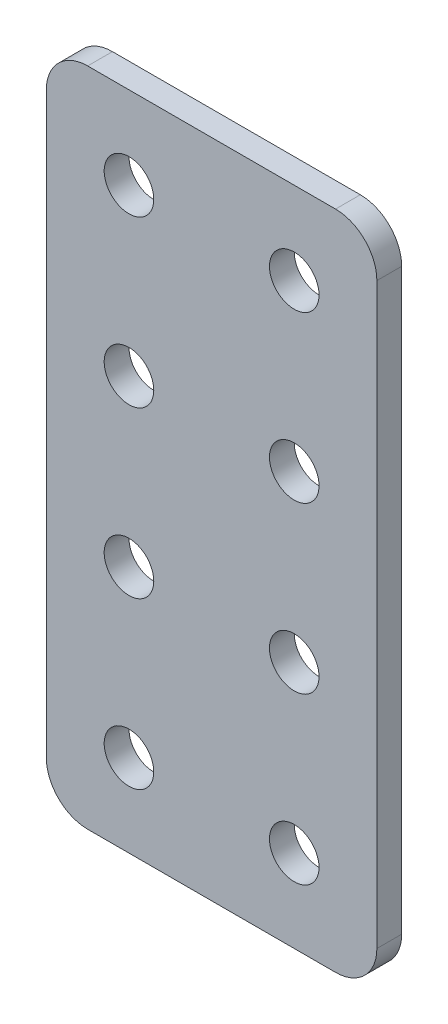
ISO-10303-21;
HEADER;
FILE_DESCRIPTION(('STEP AP214'),'2;1');
FILE_NAME('part.step','',(''),(''),'','','');
FILE_SCHEMA(('AUTOMOTIVE_DESIGN { 1 0 10303 214 1 1 1 1 }'));
ENDSEC;
DATA;
#1=APPLICATION_CONTEXT('core data for automotive mechanical design processes');
#2=APPLICATION_PROTOCOL_DEFINITION('international standard','automotive_design',2000,#1);
#3=PRODUCT_CONTEXT('',#1,'mechanical');
#4=PRODUCT('Part','Part','',(#3));
#5=PRODUCT_RELATED_PRODUCT_CATEGORY('part','',(#4));
#6=PRODUCT_DEFINITION_FORMATION('','',#4);
#7=PRODUCT_DEFINITION_CONTEXT('part definition',#1,'design');
#8=PRODUCT_DEFINITION('design','',#6,#7);
#9=PRODUCT_DEFINITION_SHAPE('','',#8);
#10=(LENGTH_UNIT() NAMED_UNIT(*) SI_UNIT(.MILLI.,.METRE.));
#11=(NAMED_UNIT(*) PLANE_ANGLE_UNIT() SI_UNIT($,.RADIAN.));
#12=(NAMED_UNIT(*) SI_UNIT($,.STERADIAN.) SOLID_ANGLE_UNIT());
#13=UNCERTAINTY_MEASURE_WITH_UNIT(LENGTH_MEASURE(1.E-05),#10,'distance_accuracy_value','');
#14=(GEOMETRIC_REPRESENTATION_CONTEXT(3) GLOBAL_UNCERTAINTY_ASSIGNED_CONTEXT((#13)) GLOBAL_UNIT_ASSIGNED_CONTEXT((#10,
#11,#12)) REPRESENTATION_CONTEXT('',''));
#15=CARTESIAN_POINT('',(0.,0.,0.));
#16=DIRECTION('',(0.,0.,1.));
#17=DIRECTION('',(1.,0.,0.));
#18=AXIS2_PLACEMENT_3D('',#15,#16,#17);
#19=CARTESIAN_POINT('',(0.,0.,3.));
#20=DIRECTION('',(0.,0.,1.));
#21=DIRECTION('',(1.,0.,0.));
#22=AXIS2_PLACEMENT_3D('',#19,#20,#21);
#23=PLANE('',#22);
#24=CARTESIAN_POINT('',(-16.4907902554961,7.41176470588237,3.));
#25=DIRECTION('',(0.,0.,1.));
#26=DIRECTION('',(1.,0.,0.));
#27=AXIS2_PLACEMENT_3D('',#24,#25,#26);
#28=CIRCLE('',#27,3.);
#29=CARTESIAN_POINT('',(-13.4907902554961,7.41176470588237,3.));
#30=VERTEX_POINT('',#29);
#31=EDGE_CURVE('E190',#30,#30,#28,.T.);
#32=ORIENTED_EDGE('',*,*,#31,.F.);
#33=EDGE_LOOP('',(#32));
#34=FACE_BOUND('',#33,.T.);
#35=CARTESIAN_POINT('',(-16.4907902554962,27.4117647058824,3.));
#36=DIRECTION('',(0.,0.,1.));
#37=DIRECTION('',(1.,0.,0.));
#38=AXIS2_PLACEMENT_3D('',#35,#36,#37);
#39=CIRCLE('',#38,3.);
#40=CARTESIAN_POINT('',(-13.4907902554962,27.4117647058824,3.));
#41=VERTEX_POINT('',#40);
#42=EDGE_CURVE('E132',#41,#41,#39,.T.);
#43=ORIENTED_EDGE('',*,*,#42,.F.);
#44=EDGE_LOOP('',(#43));
#45=FACE_BOUND('',#44,.T.);
#46=DIRECTION('',(-1.,0.,0.));
#47=VECTOR('',#46,1.);
#48=CARTESIAN_POINT('',(-26.4907902554961,-42.5882352941176,3.));
#49=LINE('',#48,#47);
#50=CARTESIAN_POINT('',(8.50920974450387,-42.5882352941176,3.));
#51=VERTEX_POINT('',#50);
#52=CARTESIAN_POINT('',(-21.4907902554961,-42.5882352941176,3.));
#53=VERTEX_POINT('',#52);
#54=EDGE_CURVE('E174',#51,#53,#49,.T.);
#55=ORIENTED_EDGE('',*,*,#54,.F.);
#56=CARTESIAN_POINT('',(8.50920974450387,-37.5882352941176,3.));
#57=DIRECTION('',(0.,0.,1.));
#58=DIRECTION('',(1.,0.,0.));
#59=AXIS2_PLACEMENT_3D('',#56,#57,#58);
#60=CIRCLE('',#59,5.);
#61=CARTESIAN_POINT('',(13.5092097445039,-37.5882352941176,3.));
#62=VERTEX_POINT('',#61);
#63=EDGE_CURVE('E149',#51,#62,#60,.T.);
#64=ORIENTED_EDGE('',*,*,#63,.T.);
#65=DIRECTION('',(0.,1.,0.));
#66=VECTOR('',#65,1.);
#67=CARTESIAN_POINT('',(13.5092097445039,37.4117647058824,3.));
#68=LINE('',#67,#66);
#69=CARTESIAN_POINT('',(13.5092097445039,32.4117647058824,3.));
#70=VERTEX_POINT('',#69);
#71=EDGE_CURVE('E118',#62,#70,#68,.T.);
#72=ORIENTED_EDGE('',*,*,#71,.T.);
#73=CARTESIAN_POINT('',(8.50920974450385,32.4117647058824,3.));
#74=DIRECTION('',(0.,0.,1.));
#75=DIRECTION('',(1.,0.,0.));
#76=AXIS2_PLACEMENT_3D('',#73,#74,#75);
#77=CIRCLE('',#76,5.);
#78=CARTESIAN_POINT('',(8.50920974450385,37.4117647058824,3.));
#79=VERTEX_POINT('',#78);
#80=EDGE_CURVE('E54',#70,#79,#77,.T.);
#81=ORIENTED_EDGE('',*,*,#80,.T.);
#82=DIRECTION('',(-1.,0.,0.));
#83=VECTOR('',#82,1.);
#84=CARTESIAN_POINT('',(-26.4907902554961,37.4117647058824,3.));
#85=LINE('',#84,#83);
#86=CARTESIAN_POINT('',(-21.4907902554961,37.4117647058824,3.));
#87=VERTEX_POINT('',#86);
#88=EDGE_CURVE('E136',#79,#87,#85,.T.);
#89=ORIENTED_EDGE('',*,*,#88,.T.);
#90=CARTESIAN_POINT('',(-21.4907902554961,32.4117647058824,3.));
#91=DIRECTION('',(0.,0.,1.));
#92=DIRECTION('',(1.,0.,0.));
#93=AXIS2_PLACEMENT_3D('',#90,#91,#92);
#94=CIRCLE('',#93,5.);
#95=CARTESIAN_POINT('',(-26.4907902554961,32.4117647058824,3.));
#96=VERTEX_POINT('',#95);
#97=EDGE_CURVE('E144',#87,#96,#94,.T.);
#98=ORIENTED_EDGE('',*,*,#97,.T.);
#99=DIRECTION('',(0.,-1.,0.));
#100=VECTOR('',#99,1.);
#101=CARTESIAN_POINT('',(-26.4907902554961,37.4117647058824,3.));
#102=LINE('',#101,#100);
#103=CARTESIAN_POINT('',(-26.4907902554961,-37.5882352941176,3.));
#104=VERTEX_POINT('',#103);
#105=EDGE_CURVE('E129',#96,#104,#102,.T.);
#106=ORIENTED_EDGE('',*,*,#105,.T.);
#107=CARTESIAN_POINT('',(-21.4907902554961,-37.5882352941176,3.));
#108=DIRECTION('',(0.,0.,1.));
#109=DIRECTION('',(1.,0.,0.));
#110=AXIS2_PLACEMENT_3D('',#107,#108,#109);
#111=CIRCLE('',#110,5.);
#112=EDGE_CURVE('E147',#104,#53,#111,.T.);
#113=ORIENTED_EDGE('',*,*,#112,.T.);
#114=EDGE_LOOP('',(#55,#64,#72,#81,#89,#98,#106,#113));
#115=FACE_BOUND('',#114,.T.);
#116=CARTESIAN_POINT('',(3.50920974450385,27.4117647058824,3.));
#117=DIRECTION('',(0.,0.,1.));
#118=DIRECTION('',(1.,0.,0.));
#119=AXIS2_PLACEMENT_3D('',#116,#117,#118);
#120=CIRCLE('',#119,3.);
#121=CARTESIAN_POINT('',(6.50920974450385,27.4117647058824,3.));
#122=VERTEX_POINT('',#121);
#123=EDGE_CURVE('E196',#122,#122,#120,.T.);
#124=ORIENTED_EDGE('',*,*,#123,.F.);
#125=EDGE_LOOP('',(#124));
#126=FACE_BOUND('',#125,.T.);
#127=CARTESIAN_POINT('',(3.50920974450386,7.41176470588237,3.));
#128=DIRECTION('',(0.,0.,1.));
#129=DIRECTION('',(1.,0.,0.));
#130=AXIS2_PLACEMENT_3D('',#127,#128,#129);
#131=CIRCLE('',#130,3.);
#132=CARTESIAN_POINT('',(6.50920974450386,7.41176470588237,3.));
#133=VERTEX_POINT('',#132);
#134=EDGE_CURVE('E184',#133,#133,#131,.T.);
#135=ORIENTED_EDGE('',*,*,#134,.F.);
#136=EDGE_LOOP('',(#135));
#137=FACE_BOUND('',#136,.T.);
#138=CARTESIAN_POINT('',(3.50920974450386,-12.5882352941176,3.));
#139=DIRECTION('',(0.,0.,-1.));
#140=DIRECTION('',(1.,0.,0.));
#141=AXIS2_PLACEMENT_3D('',#138,#139,#140);
#142=CIRCLE('',#141,3.);
#143=CARTESIAN_POINT('',(6.50920974450386,-12.5882352941176,3.));
#144=VERTEX_POINT('',#143);
#145=EDGE_CURVE('E307',#144,#144,#142,.T.);
#146=ORIENTED_EDGE('',*,*,#145,.T.);
#147=EDGE_LOOP('',(#146));
#148=FACE_BOUND('',#147,.T.);
#149=CARTESIAN_POINT('',(-16.4907902554961,-12.5882352941176,3.));
#150=DIRECTION('',(0.,0.,-1.));
#151=DIRECTION('',(1.,0.,0.));
#152=AXIS2_PLACEMENT_3D('',#149,#150,#151);
#153=CIRCLE('',#152,3.);
#154=CARTESIAN_POINT('',(-13.4907902554961,-12.5882352941176,3.));
#155=VERTEX_POINT('',#154);
#156=EDGE_CURVE('E304',#155,#155,#153,.T.);
#157=ORIENTED_EDGE('',*,*,#156,.T.);
#158=EDGE_LOOP('',(#157));
#159=FACE_BOUND('',#158,.T.);
#160=CARTESIAN_POINT('',(3.50920974450385,-32.5882352941176,3.));
#161=DIRECTION('',(0.,0.,-1.));
#162=DIRECTION('',(1.,0.,0.));
#163=AXIS2_PLACEMENT_3D('',#160,#161,#162);
#164=CIRCLE('',#163,3.);
#165=CARTESIAN_POINT('',(6.50920974450385,-32.5882352941176,3.));
#166=VERTEX_POINT('',#165);
#167=EDGE_CURVE('E300',#166,#166,#164,.T.);
#168=ORIENTED_EDGE('',*,*,#167,.T.);
#169=EDGE_LOOP('',(#168));
#170=FACE_BOUND('',#169,.T.);
#171=CARTESIAN_POINT('',(-16.4907902554962,-32.5882352941176,3.));
#172=DIRECTION('',(0.,0.,-1.));
#173=DIRECTION('',(1.,0.,0.));
#174=AXIS2_PLACEMENT_3D('',#171,#172,#173);
#175=CIRCLE('',#174,3.);
#176=CARTESIAN_POINT('',(-13.4907902554962,-32.5882352941176,3.));
#177=VERTEX_POINT('',#176);
#178=EDGE_CURVE('E175',#177,#177,#175,.T.);
#179=ORIENTED_EDGE('',*,*,#178,.T.);
#180=EDGE_LOOP('',(#179));
#181=FACE_BOUND('',#180,.T.);
#182=ADVANCED_FACE('F33',(#34,#45,#115,#126,#137,#148,#159,#170,#181),#23,.T.);
#183=CARTESIAN_POINT('',(0.,0.,0.));
#184=DIRECTION('',(0.,0.,1.));
#185=DIRECTION('',(1.,0.,0.));
#186=AXIS2_PLACEMENT_3D('',#183,#184,#185);
#187=PLANE('',#186);
#188=DIRECTION('',(0.,1.,0.));
#189=VECTOR('',#188,1.);
#190=CARTESIAN_POINT('',(13.5092097445039,37.4117647058824,0.));
#191=LINE('',#190,#189);
#192=CARTESIAN_POINT('',(13.5092097445039,-37.5882352941176,0.));
#193=VERTEX_POINT('',#192);
#194=CARTESIAN_POINT('',(13.5092097445039,32.4117647058824,0.));
#195=VERTEX_POINT('',#194);
#196=EDGE_CURVE('E116',#193,#195,#191,.T.);
#197=ORIENTED_EDGE('',*,*,#196,.F.);
#198=CARTESIAN_POINT('',(8.50920974450387,-37.5882352941176,0.));
#199=DIRECTION('',(0.,0.,1.));
#200=DIRECTION('',(1.,0.,0.));
#201=AXIS2_PLACEMENT_3D('',#198,#199,#200);
#202=CIRCLE('',#201,5.);
#203=CARTESIAN_POINT('',(8.50920974450387,-42.5882352941176,0.));
#204=VERTEX_POINT('',#203);
#205=EDGE_CURVE('E99',#193,#204,#202,.F.);
#206=ORIENTED_EDGE('',*,*,#205,.T.);
#207=DIRECTION('',(-1.,0.,0.));
#208=VECTOR('',#207,1.);
#209=CARTESIAN_POINT('',(-26.4907902554961,-42.5882352941176,0.));
#210=LINE('',#209,#208);
#211=CARTESIAN_POINT('',(-21.4907902554961,-42.5882352941176,0.));
#212=VERTEX_POINT('',#211);
#213=EDGE_CURVE('E173',#204,#212,#210,.T.);
#214=ORIENTED_EDGE('',*,*,#213,.T.);
#215=CARTESIAN_POINT('',(-21.4907902554961,-37.5882352941176,0.));
#216=DIRECTION('',(0.,0.,1.));
#217=DIRECTION('',(1.,0.,0.));
#218=AXIS2_PLACEMENT_3D('',#215,#216,#217);
#219=CIRCLE('',#218,5.);
#220=CARTESIAN_POINT('',(-26.4907902554961,-37.5882352941176,0.));
#221=VERTEX_POINT('',#220);
#222=EDGE_CURVE('E110',#212,#221,#219,.F.);
#223=ORIENTED_EDGE('',*,*,#222,.T.);
#224=DIRECTION('',(0.,-1.,0.));
#225=VECTOR('',#224,1.);
#226=CARTESIAN_POINT('',(-26.4907902554961,37.4117647058824,0.));
#227=LINE('',#226,#225);
#228=CARTESIAN_POINT('',(-26.4907902554961,32.4117647058824,0.));
#229=VERTEX_POINT('',#228);
#230=EDGE_CURVE('E127',#229,#221,#227,.T.);
#231=ORIENTED_EDGE('',*,*,#230,.F.);
#232=CARTESIAN_POINT('',(-21.4907902554961,32.4117647058824,0.));
#233=DIRECTION('',(0.,0.,1.));
#234=DIRECTION('',(1.,0.,0.));
#235=AXIS2_PLACEMENT_3D('',#232,#233,#234);
#236=CIRCLE('',#235,5.);
#237=CARTESIAN_POINT('',(-21.4907902554961,37.4117647058824,0.));
#238=VERTEX_POINT('',#237);
#239=EDGE_CURVE('E119',#229,#238,#236,.F.);
#240=ORIENTED_EDGE('',*,*,#239,.T.);
#241=DIRECTION('',(-1.,0.,0.));
#242=VECTOR('',#241,1.);
#243=CARTESIAN_POINT('',(-26.4907902554961,37.4117647058824,0.));
#244=LINE('',#243,#242);
#245=CARTESIAN_POINT('',(8.50920974450385,37.4117647058824,0.));
#246=VERTEX_POINT('',#245);
#247=EDGE_CURVE('E126',#246,#238,#244,.T.);
#248=ORIENTED_EDGE('',*,*,#247,.F.);
#249=CARTESIAN_POINT('',(8.50920974450385,32.4117647058824,0.));
#250=DIRECTION('',(0.,0.,1.));
#251=DIRECTION('',(1.,0.,0.));
#252=AXIS2_PLACEMENT_3D('',#249,#250,#251);
#253=CIRCLE('',#252,5.);
#254=EDGE_CURVE('E125',#246,#195,#253,.F.);
#255=ORIENTED_EDGE('',*,*,#254,.T.);
#256=EDGE_LOOP('',(#197,#206,#214,#223,#231,#240,#248,#255));
#257=FACE_BOUND('',#256,.T.);
#258=CARTESIAN_POINT('',(-16.4907902554962,27.4117647058824,0.));
#259=DIRECTION('',(0.,0.,1.));
#260=DIRECTION('',(1.,0.,0.));
#261=AXIS2_PLACEMENT_3D('',#258,#259,#260);
#262=CIRCLE('',#261,3.);
#263=CARTESIAN_POINT('',(-13.4907902554962,27.4117647058824,0.));
#264=VERTEX_POINT('',#263);
#265=EDGE_CURVE('E199',#264,#264,#262,.T.);
#266=ORIENTED_EDGE('',*,*,#265,.T.);
#267=EDGE_LOOP('',(#266));
#268=FACE_BOUND('',#267,.T.);
#269=CARTESIAN_POINT('',(3.50920974450385,27.4117647058824,0.));
#270=DIRECTION('',(0.,0.,1.));
#271=DIRECTION('',(1.,0.,0.));
#272=AXIS2_PLACEMENT_3D('',#269,#270,#271);
#273=CIRCLE('',#272,3.);
#274=CARTESIAN_POINT('',(6.50920974450385,27.4117647058824,0.));
#275=VERTEX_POINT('',#274);
#276=EDGE_CURVE('E193',#275,#275,#273,.T.);
#277=ORIENTED_EDGE('',*,*,#276,.T.);
#278=EDGE_LOOP('',(#277));
#279=FACE_BOUND('',#278,.T.);
#280=CARTESIAN_POINT('',(-16.4907902554961,7.41176470588237,0.));
#281=DIRECTION('',(0.,0.,1.));
#282=DIRECTION('',(1.,0.,0.));
#283=AXIS2_PLACEMENT_3D('',#280,#281,#282);
#284=CIRCLE('',#283,3.);
#285=CARTESIAN_POINT('',(-13.4907902554961,7.41176470588237,0.));
#286=VERTEX_POINT('',#285);
#287=EDGE_CURVE('E187',#286,#286,#284,.T.);
#288=ORIENTED_EDGE('',*,*,#287,.T.);
#289=EDGE_LOOP('',(#288));
#290=FACE_BOUND('',#289,.T.);
#291=CARTESIAN_POINT('',(3.50920974450386,7.41176470588237,0.));
#292=DIRECTION('',(0.,0.,1.));
#293=DIRECTION('',(1.,0.,0.));
#294=AXIS2_PLACEMENT_3D('',#291,#292,#293);
#295=CIRCLE('',#294,3.);
#296=CARTESIAN_POINT('',(6.50920974450386,7.41176470588237,0.));
#297=VERTEX_POINT('',#296);
#298=EDGE_CURVE('E177',#297,#297,#295,.T.);
#299=ORIENTED_EDGE('',*,*,#298,.T.);
#300=EDGE_LOOP('',(#299));
#301=FACE_BOUND('',#300,.T.);
#302=CARTESIAN_POINT('',(3.50920974450386,-12.5882352941176,0.));
#303=DIRECTION('',(0.,0.,-1.));
#304=DIRECTION('',(1.,0.,0.));
#305=AXIS2_PLACEMENT_3D('',#302,#303,#304);
#306=CIRCLE('',#305,3.);
#307=CARTESIAN_POINT('',(6.50920974450386,-12.5882352941176,0.));
#308=VERTEX_POINT('',#307);
#309=EDGE_CURVE('E288',#308,#308,#306,.T.);
#310=ORIENTED_EDGE('',*,*,#309,.F.);
#311=EDGE_LOOP('',(#310));
#312=FACE_BOUND('',#311,.T.);
#313=CARTESIAN_POINT('',(-16.4907902554961,-12.5882352941176,0.));
#314=DIRECTION('',(0.,0.,-1.));
#315=DIRECTION('',(1.,0.,0.));
#316=AXIS2_PLACEMENT_3D('',#313,#314,#315);
#317=CIRCLE('',#316,3.);
#318=CARTESIAN_POINT('',(-13.4907902554961,-12.5882352941176,0.));
#319=VERTEX_POINT('',#318);
#320=EDGE_CURVE('E292',#319,#319,#317,.T.);
#321=ORIENTED_EDGE('',*,*,#320,.F.);
#322=EDGE_LOOP('',(#321));
#323=FACE_BOUND('',#322,.T.);
#324=CARTESIAN_POINT('',(3.50920974450385,-32.5882352941176,0.));
#325=DIRECTION('',(0.,0.,-1.));
#326=DIRECTION('',(1.,0.,0.));
#327=AXIS2_PLACEMENT_3D('',#324,#325,#326);
#328=CIRCLE('',#327,3.);
#329=CARTESIAN_POINT('',(6.50920974450385,-32.5882352941176,0.));
#330=VERTEX_POINT('',#329);
#331=EDGE_CURVE('E296',#330,#330,#328,.T.);
#332=ORIENTED_EDGE('',*,*,#331,.F.);
#333=EDGE_LOOP('',(#332));
#334=FACE_BOUND('',#333,.T.);
#335=CARTESIAN_POINT('',(-16.4907902554962,-32.5882352941176,0.));
#336=DIRECTION('',(0.,0.,-1.));
#337=DIRECTION('',(1.,0.,0.));
#338=AXIS2_PLACEMENT_3D('',#335,#336,#337);
#339=CIRCLE('',#338,3.);
#340=CARTESIAN_POINT('',(-13.4907902554962,-32.5882352941176,0.));
#341=VERTEX_POINT('',#340);
#342=EDGE_CURVE('E180',#341,#341,#339,.T.);
#343=ORIENTED_EDGE('',*,*,#342,.F.);
#344=EDGE_LOOP('',(#343));
#345=FACE_BOUND('',#344,.T.);
#346=ADVANCED_FACE('F122',(#257,#268,#279,#290,#301,#312,#323,#334,#345),#187,.F.);
#347=CARTESIAN_POINT('',(-26.4907902554961,37.4117647058824,3.));
#348=DIRECTION('',(1.,0.,0.));
#349=DIRECTION('',(0.,1.,0.));
#350=AXIS2_PLACEMENT_3D('',#347,#348,#349);
#351=PLANE('',#350);
#352=ORIENTED_EDGE('',*,*,#230,.T.);
#353=DIRECTION('',(0.,0.,-1.));
#354=VECTOR('',#353,1.);
#355=CARTESIAN_POINT('',(-26.4907902554961,-37.5882352941176,3.));
#356=LINE('',#355,#354);
#357=EDGE_CURVE('E154',#221,#104,#356,.F.);
#358=ORIENTED_EDGE('',*,*,#357,.T.);
#359=ORIENTED_EDGE('',*,*,#105,.F.);
#360=DIRECTION('',(0.,0.,-1.));
#361=VECTOR('',#360,1.);
#362=CARTESIAN_POINT('',(-26.4907902554961,32.4117647058824,3.));
#363=LINE('',#362,#361);
#364=EDGE_CURVE('E151',#96,#229,#363,.T.);
#365=ORIENTED_EDGE('',*,*,#364,.T.);
#366=EDGE_LOOP('',(#352,#358,#359,#365));
#367=FACE_BOUND('',#366,.T.);
#368=ADVANCED_FACE('F159',(#367),#351,.F.);
#369=CARTESIAN_POINT('',(13.5092097445039,37.4117647058824,3.));
#370=DIRECTION('',(-1.,0.,0.));
#371=DIRECTION('',(0.,-1.,0.));
#372=AXIS2_PLACEMENT_3D('',#369,#370,#371);
#373=PLANE('',#372);
#374=ORIENTED_EDGE('',*,*,#71,.F.);
#375=DIRECTION('',(0.,0.,-1.));
#376=VECTOR('',#375,1.);
#377=CARTESIAN_POINT('',(13.5092097445039,-37.5882352941176,0.));
#378=LINE('',#377,#376);
#379=EDGE_CURVE('E103',#62,#193,#378,.T.);
#380=ORIENTED_EDGE('',*,*,#379,.T.);
#381=ORIENTED_EDGE('',*,*,#196,.T.);
#382=DIRECTION('',(0.,0.,-1.));
#383=VECTOR('',#382,1.);
#384=CARTESIAN_POINT('',(13.5092097445039,32.4117647058824,3.));
#385=LINE('',#384,#383);
#386=EDGE_CURVE('E120',#195,#70,#385,.F.);
#387=ORIENTED_EDGE('',*,*,#386,.T.);
#388=EDGE_LOOP('',(#374,#380,#381,#387));
#389=FACE_BOUND('',#388,.T.);
#390=ADVANCED_FACE('F115',(#389),#373,.F.);
#391=CARTESIAN_POINT('',(-26.4907902554961,37.4117647058824,3.));
#392=DIRECTION('',(0.,-1.,0.));
#393=DIRECTION('',(0.,0.,-1.));
#394=AXIS2_PLACEMENT_3D('',#391,#392,#393);
#395=PLANE('',#394);
#396=ORIENTED_EDGE('',*,*,#88,.F.);
#397=DIRECTION('',(0.,0.,-1.));
#398=VECTOR('',#397,1.);
#399=CARTESIAN_POINT('',(8.50920974450385,37.4117647058824,3.));
#400=LINE('',#399,#398);
#401=EDGE_CURVE('E11',#79,#246,#400,.T.);
#402=ORIENTED_EDGE('',*,*,#401,.T.);
#403=ORIENTED_EDGE('',*,*,#247,.T.);
#404=DIRECTION('',(0.,0.,-1.));
#405=VECTOR('',#404,1.);
#406=CARTESIAN_POINT('',(-21.4907902554961,37.4117647058824,3.));
#407=LINE('',#406,#405);
#408=EDGE_CURVE('E41',#238,#87,#407,.F.);
#409=ORIENTED_EDGE('',*,*,#408,.T.);
#410=EDGE_LOOP('',(#396,#402,#403,#409));
#411=FACE_BOUND('',#410,.T.);
#412=ADVANCED_FACE('F208',(#411),#395,.F.);
#413=CARTESIAN_POINT('',(-16.4907902554962,27.4117647058824,3.));
#414=DIRECTION('',(0.,0.,-1.));
#415=DIRECTION('',(-1.,0.,0.));
#416=AXIS2_PLACEMENT_3D('',#413,#414,#415);
#417=CYLINDRICAL_SURFACE('',#416,3.);
#418=ORIENTED_EDGE('',*,*,#42,.T.);
#419=EDGE_LOOP('',(#418));
#420=FACE_BOUND('',#419,.T.);
#421=ORIENTED_EDGE('',*,*,#265,.F.);
#422=EDGE_LOOP('',(#421));
#423=FACE_BOUND('',#422,.T.);
#424=ADVANCED_FACE('F227',(#420,#423),#417,.F.);
#425=CARTESIAN_POINT('',(3.50920974450385,27.4117647058824,3.));
#426=DIRECTION('',(0.,0.,-1.));
#427=DIRECTION('',(-1.,0.,0.));
#428=AXIS2_PLACEMENT_3D('',#425,#426,#427);
#429=CYLINDRICAL_SURFACE('',#428,3.);
#430=ORIENTED_EDGE('',*,*,#123,.T.);
#431=EDGE_LOOP('',(#430));
#432=FACE_BOUND('',#431,.T.);
#433=ORIENTED_EDGE('',*,*,#276,.F.);
#434=EDGE_LOOP('',(#433));
#435=FACE_BOUND('',#434,.T.);
#436=ADVANCED_FACE('F268',(#432,#435),#429,.F.);
#437=CARTESIAN_POINT('',(-16.4907902554961,7.41176470588237,3.));
#438=DIRECTION('',(0.,0.,-1.));
#439=DIRECTION('',(-1.,0.,0.));
#440=AXIS2_PLACEMENT_3D('',#437,#438,#439);
#441=CYLINDRICAL_SURFACE('',#440,3.);
#442=ORIENTED_EDGE('',*,*,#31,.T.);
#443=EDGE_LOOP('',(#442));
#444=FACE_BOUND('',#443,.T.);
#445=ORIENTED_EDGE('',*,*,#287,.F.);
#446=EDGE_LOOP('',(#445));
#447=FACE_BOUND('',#446,.T.);
#448=ADVANCED_FACE('F265',(#444,#447),#441,.F.);
#449=CARTESIAN_POINT('',(3.50920974450386,7.41176470588237,3.));
#450=DIRECTION('',(0.,0.,-1.));
#451=DIRECTION('',(-1.,0.,0.));
#452=AXIS2_PLACEMENT_3D('',#449,#450,#451);
#453=CYLINDRICAL_SURFACE('',#452,3.);
#454=ORIENTED_EDGE('',*,*,#134,.T.);
#455=EDGE_LOOP('',(#454));
#456=FACE_BOUND('',#455,.T.);
#457=ORIENTED_EDGE('',*,*,#298,.F.);
#458=EDGE_LOOP('',(#457));
#459=FACE_BOUND('',#458,.T.);
#460=ADVANCED_FACE('F262',(#456,#459),#453,.F.);
#461=CARTESIAN_POINT('',(-26.4907902554961,-42.5882352941176,3.));
#462=DIRECTION('',(0.,-1.,0.));
#463=DIRECTION('',(0.,0.,-1.));
#464=AXIS2_PLACEMENT_3D('',#461,#462,#463);
#465=PLANE('',#464);
#466=ORIENTED_EDGE('',*,*,#213,.F.);
#467=DIRECTION('',(0.,0.,-1.));
#468=VECTOR('',#467,1.);
#469=CARTESIAN_POINT('',(8.50920974450387,-42.5882352941176,3.));
#470=LINE('',#469,#468);
#471=EDGE_CURVE('E104',#204,#51,#470,.F.);
#472=ORIENTED_EDGE('',*,*,#471,.T.);
#473=ORIENTED_EDGE('',*,*,#54,.T.);
#474=DIRECTION('',(0.,0.,-1.));
#475=VECTOR('',#474,1.);
#476=CARTESIAN_POINT('',(-21.4907902554961,-42.5882352941176,0.));
#477=LINE('',#476,#475);
#478=EDGE_CURVE('E109',#53,#212,#477,.T.);
#479=ORIENTED_EDGE('',*,*,#478,.T.);
#480=EDGE_LOOP('',(#466,#472,#473,#479));
#481=FACE_BOUND('',#480,.T.);
#482=ADVANCED_FACE('F172',(#481),#465,.T.);
#483=CARTESIAN_POINT('',(-16.4907902554962,-32.5882352941176,3.));
#484=DIRECTION('',(0.,0.,-1.));
#485=DIRECTION('',(-1.,0.,0.));
#486=AXIS2_PLACEMENT_3D('',#483,#484,#485);
#487=CYLINDRICAL_SURFACE('',#486,3.);
#488=ORIENTED_EDGE('',*,*,#178,.F.);
#489=EDGE_LOOP('',(#488));
#490=FACE_BOUND('',#489,.T.);
#491=ORIENTED_EDGE('',*,*,#342,.T.);
#492=EDGE_LOOP('',(#491));
#493=FACE_BOUND('',#492,.T.);
#494=ADVANCED_FACE('F255',(#490,#493),#487,.F.);
#495=CARTESIAN_POINT('',(3.50920974450385,-32.5882352941176,3.));
#496=DIRECTION('',(0.,0.,-1.));
#497=DIRECTION('',(-1.,0.,0.));
#498=AXIS2_PLACEMENT_3D('',#495,#496,#497);
#499=CYLINDRICAL_SURFACE('',#498,3.);
#500=ORIENTED_EDGE('',*,*,#167,.F.);
#501=EDGE_LOOP('',(#500));
#502=FACE_BOUND('',#501,.T.);
#503=ORIENTED_EDGE('',*,*,#331,.T.);
#504=EDGE_LOOP('',(#503));
#505=FACE_BOUND('',#504,.T.);
#506=ADVANCED_FACE('F247',(#502,#505),#499,.F.);
#507=CARTESIAN_POINT('',(-16.4907902554961,-12.5882352941176,3.));
#508=DIRECTION('',(0.,0.,-1.));
#509=DIRECTION('',(-1.,0.,0.));
#510=AXIS2_PLACEMENT_3D('',#507,#508,#509);
#511=CYLINDRICAL_SURFACE('',#510,3.);
#512=ORIENTED_EDGE('',*,*,#156,.F.);
#513=EDGE_LOOP('',(#512));
#514=FACE_BOUND('',#513,.T.);
#515=ORIENTED_EDGE('',*,*,#320,.T.);
#516=EDGE_LOOP('',(#515));
#517=FACE_BOUND('',#516,.T.);
#518=ADVANCED_FACE('F241',(#514,#517),#511,.F.);
#519=CARTESIAN_POINT('',(3.50920974450386,-12.5882352941176,3.));
#520=DIRECTION('',(0.,0.,-1.));
#521=DIRECTION('',(-1.,0.,0.));
#522=AXIS2_PLACEMENT_3D('',#519,#520,#521);
#523=CYLINDRICAL_SURFACE('',#522,3.);
#524=ORIENTED_EDGE('',*,*,#145,.F.);
#525=EDGE_LOOP('',(#524));
#526=FACE_BOUND('',#525,.T.);
#527=ORIENTED_EDGE('',*,*,#309,.T.);
#528=EDGE_LOOP('',(#527));
#529=FACE_BOUND('',#528,.T.);
#530=ADVANCED_FACE('F237',(#526,#529),#523,.F.);
#531=CARTESIAN_POINT('',(8.50920974450387,-37.5882352941176,3.));
#532=DIRECTION('',(0.,0.,1.));
#533=DIRECTION('',(1.,0.,0.));
#534=AXIS2_PLACEMENT_3D('',#531,#532,#533);
#535=CYLINDRICAL_SURFACE('',#534,5.);
#536=ORIENTED_EDGE('',*,*,#63,.F.);
#537=ORIENTED_EDGE('',*,*,#471,.F.);
#538=ORIENTED_EDGE('',*,*,#205,.F.);
#539=ORIENTED_EDGE('',*,*,#379,.F.);
#540=EDGE_LOOP('',(#536,#537,#538,#539));
#541=FACE_BOUND('',#540,.T.);
#542=ADVANCED_FACE('F102',(#541),#535,.T.);
#543=CARTESIAN_POINT('',(-21.4907902554961,-37.5882352941176,3.));
#544=DIRECTION('',(0.,0.,1.));
#545=DIRECTION('',(1.,0.,0.));
#546=AXIS2_PLACEMENT_3D('',#543,#544,#545);
#547=CYLINDRICAL_SURFACE('',#546,5.);
#548=ORIENTED_EDGE('',*,*,#112,.F.);
#549=ORIENTED_EDGE('',*,*,#357,.F.);
#550=ORIENTED_EDGE('',*,*,#222,.F.);
#551=ORIENTED_EDGE('',*,*,#478,.F.);
#552=EDGE_LOOP('',(#548,#549,#550,#551));
#553=FACE_BOUND('',#552,.T.);
#554=ADVANCED_FACE('F170',(#553),#547,.T.);
#555=CARTESIAN_POINT('',(8.50920974450385,32.4117647058824,3.));
#556=DIRECTION('',(0.,0.,-1.));
#557=DIRECTION('',(-1.,0.,0.));
#558=AXIS2_PLACEMENT_3D('',#555,#556,#557);
#559=CYLINDRICAL_SURFACE('',#558,5.);
#560=ORIENTED_EDGE('',*,*,#80,.F.);
#561=ORIENTED_EDGE('',*,*,#386,.F.);
#562=ORIENTED_EDGE('',*,*,#254,.F.);
#563=ORIENTED_EDGE('',*,*,#401,.F.);
#564=EDGE_LOOP('',(#560,#561,#562,#563));
#565=FACE_BOUND('',#564,.T.);
#566=ADVANCED_FACE('F210',(#565),#559,.T.);
#567=CARTESIAN_POINT('',(-21.4907902554961,32.4117647058824,3.));
#568=DIRECTION('',(0.,0.,-1.));
#569=DIRECTION('',(-1.,0.,0.));
#570=AXIS2_PLACEMENT_3D('',#567,#568,#569);
#571=CYLINDRICAL_SURFACE('',#570,5.);
#572=ORIENTED_EDGE('',*,*,#97,.F.);
#573=ORIENTED_EDGE('',*,*,#408,.F.);
#574=ORIENTED_EDGE('',*,*,#239,.F.);
#575=ORIENTED_EDGE('',*,*,#364,.F.);
#576=EDGE_LOOP('',(#572,#573,#574,#575));
#577=FACE_BOUND('',#576,.T.);
#578=ADVANCED_FACE('F35',(#577),#571,.T.);
#579=CLOSED_SHELL('',(#182,#346,#368,#390,#412,#424,#436,#448,#460,#482,#494,#506,#518,#530,
#542,#554,#566,#578));
#580=MANIFOLD_SOLID_BREP('B2',#579);
#581=ADVANCED_BREP_SHAPE_REPRESENTATION('',(#18,#580),#14);
#582=SHAPE_DEFINITION_REPRESENTATION(#9,#581);
ENDSEC;
END-ISO-10303-21;
